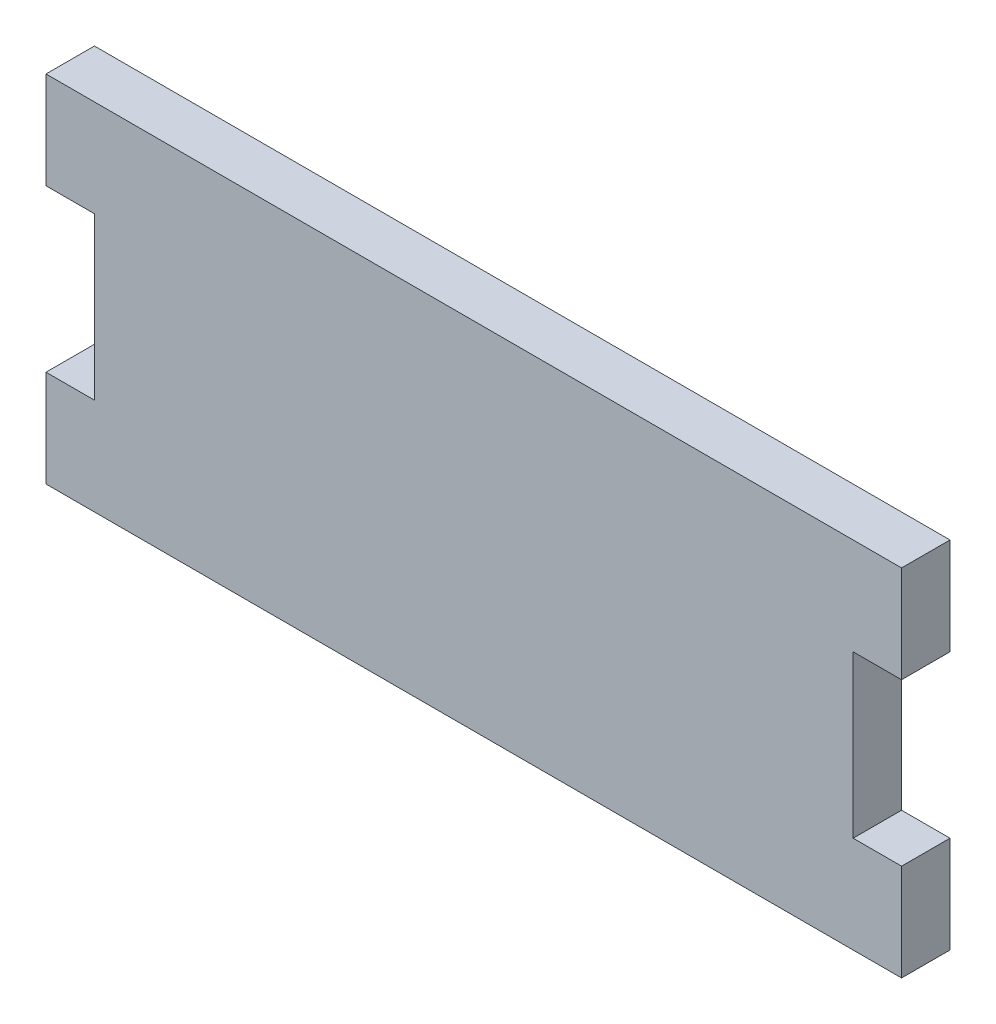
ISO-10303-21;
HEADER;
FILE_DESCRIPTION(('STEP AP214'),'2;1');
FILE_NAME('part.step','',(''),(''),'','','');
FILE_SCHEMA(('AUTOMOTIVE_DESIGN { 1 0 10303 214 1 1 1 1 }'));
ENDSEC;
DATA;
#1=APPLICATION_CONTEXT('core data for automotive mechanical design processes');
#2=APPLICATION_PROTOCOL_DEFINITION('international standard','automotive_design',2000,#1);
#3=PRODUCT_CONTEXT('',#1,'mechanical');
#4=PRODUCT('Part','Part','',(#3));
#5=PRODUCT_RELATED_PRODUCT_CATEGORY('part','',(#4));
#6=PRODUCT_DEFINITION_FORMATION('','',#4);
#7=PRODUCT_DEFINITION_CONTEXT('part definition',#1,'design');
#8=PRODUCT_DEFINITION('design','',#6,#7);
#9=PRODUCT_DEFINITION_SHAPE('','',#8);
#10=(LENGTH_UNIT() NAMED_UNIT(*) SI_UNIT(.MILLI.,.METRE.));
#11=(NAMED_UNIT(*) PLANE_ANGLE_UNIT() SI_UNIT($,.RADIAN.));
#12=(NAMED_UNIT(*) SI_UNIT($,.STERADIAN.) SOLID_ANGLE_UNIT());
#13=UNCERTAINTY_MEASURE_WITH_UNIT(LENGTH_MEASURE(1.E-05),#10,'distance_accuracy_value','');
#14=(GEOMETRIC_REPRESENTATION_CONTEXT(3) GLOBAL_UNCERTAINTY_ASSIGNED_CONTEXT((#13)) GLOBAL_UNIT_ASSIGNED_CONTEXT((#10,
#11,#12)) REPRESENTATION_CONTEXT('',''));
#15=CARTESIAN_POINT('',(0.,0.,0.));
#16=DIRECTION('',(0.,0.,1.));
#17=DIRECTION('',(1.,0.,0.));
#18=AXIS2_PLACEMENT_3D('',#15,#16,#17);
#19=CARTESIAN_POINT('',(54.,11.,1.5));
#20=DIRECTION('',(1.,0.,0.));
#21=DIRECTION('',(0.,0.,-1.));
#22=AXIS2_PLACEMENT_3D('',#19,#20,#21);
#23=PLANE('',#22);
#24=DIRECTION('',(0.,0.,1.));
#25=VECTOR('',#24,1.);
#26=CARTESIAN_POINT('',(54.,5.,-1.5));
#27=LINE('',#26,#25);
#28=CARTESIAN_POINT('',(54.,5.,-1.5));
#29=VERTEX_POINT('',#28);
#30=CARTESIAN_POINT('',(54.,5.,1.5));
#31=VERTEX_POINT('',#30);
#32=EDGE_CURVE('E204',#29,#31,#27,.T.);
#33=ORIENTED_EDGE('',*,*,#32,.F.);
#34=DIRECTION('',(0.,-1.,0.));
#35=VECTOR('',#34,1.);
#36=CARTESIAN_POINT('',(54.,11.,-1.5));
#37=LINE('',#36,#35);
#38=CARTESIAN_POINT('',(54.,11.,-1.5));
#39=VERTEX_POINT('',#38);
#40=EDGE_CURVE('E149',#39,#29,#37,.T.);
#41=ORIENTED_EDGE('',*,*,#40,.F.);
#42=DIRECTION('',(0.,0.,-1.));
#43=VECTOR('',#42,1.);
#44=CARTESIAN_POINT('',(54.,11.,1.5));
#45=LINE('',#44,#43);
#46=CARTESIAN_POINT('',(54.,11.,1.5));
#47=VERTEX_POINT('',#46);
#48=EDGE_CURVE('E40',#47,#39,#45,.T.);
#49=ORIENTED_EDGE('',*,*,#48,.F.);
#50=DIRECTION('',(0.,-1.,0.));
#51=VECTOR('',#50,1.);
#52=CARTESIAN_POINT('',(54.,11.,1.5));
#53=LINE('',#52,#51);
#54=EDGE_CURVE('E158',#47,#31,#53,.T.);
#55=ORIENTED_EDGE('',*,*,#54,.T.);
#56=EDGE_LOOP('',(#33,#41,#49,#55));
#57=FACE_BOUND('',#56,.T.);
#58=ADVANCED_FACE('F32',(#57),#23,.T.);
#59=CARTESIAN_POINT('',(35.,-11.,1.5));
#60=DIRECTION('',(0.,1.,0.));
#61=DIRECTION('',(-1.,0.,0.));
#62=AXIS2_PLACEMENT_3D('',#59,#60,#61);
#63=PLANE('',#62);
#64=DIRECTION('',(1.,0.,0.));
#65=VECTOR('',#64,1.);
#66=CARTESIAN_POINT('',(35.,-11.,-1.5));
#67=LINE('',#66,#65);
#68=CARTESIAN_POINT('',(1.00000000000002,-11.,-1.5));
#69=VERTEX_POINT('',#68);
#70=CARTESIAN_POINT('',(54.,-11.,-1.5));
#71=VERTEX_POINT('',#70);
#72=EDGE_CURVE('E162',#69,#71,#67,.T.);
#73=ORIENTED_EDGE('',*,*,#72,.T.);
#74=DIRECTION('',(0.,0.,-1.));
#75=VECTOR('',#74,1.);
#76=CARTESIAN_POINT('',(54.,-11.,1.5));
#77=LINE('',#76,#75);
#78=CARTESIAN_POINT('',(54.,-11.,1.5));
#79=VERTEX_POINT('',#78);
#80=EDGE_CURVE('E11',#79,#71,#77,.T.);
#81=ORIENTED_EDGE('',*,*,#80,.F.);
#82=DIRECTION('',(1.,0.,0.));
#83=VECTOR('',#82,1.);
#84=CARTESIAN_POINT('',(35.,-11.,1.5));
#85=LINE('',#84,#83);
#86=CARTESIAN_POINT('',(1.00000000000002,-11.,1.5));
#87=VERTEX_POINT('',#86);
#88=EDGE_CURVE('E148',#87,#79,#85,.T.);
#89=ORIENTED_EDGE('',*,*,#88,.F.);
#90=DIRECTION('',(0.,0.,-1.));
#91=VECTOR('',#90,1.);
#92=CARTESIAN_POINT('',(1.00000000000002,-11.,1.5));
#93=LINE('',#92,#91);
#94=EDGE_CURVE('E132',#87,#69,#93,.T.);
#95=ORIENTED_EDGE('',*,*,#94,.T.);
#96=EDGE_LOOP('',(#73,#81,#89,#95));
#97=FACE_BOUND('',#96,.T.);
#98=ADVANCED_FACE('F34',(#97),#63,.F.);
#99=DIRECTION('',(0.,0.,1.));
#100=VECTOR('',#99,1.);
#101=CARTESIAN_POINT('',(54.,-5.,-1.5));
#102=LINE('',#101,#100);
#103=CARTESIAN_POINT('',(54.,-5.,-1.5));
#104=VERTEX_POINT('',#103);
#105=CARTESIAN_POINT('',(54.,-5.,1.5));
#106=VERTEX_POINT('',#105);
#107=EDGE_CURVE('E47',#104,#106,#102,.T.);
#108=ORIENTED_EDGE('',*,*,#107,.T.);
#109=EDGE_CURVE('E152',#106,#79,#53,.T.);
#110=ORIENTED_EDGE('',*,*,#109,.T.);
#111=ORIENTED_EDGE('',*,*,#80,.T.);
#112=EDGE_CURVE('E154',#104,#71,#37,.T.);
#113=ORIENTED_EDGE('',*,*,#112,.F.);
#114=EDGE_LOOP('',(#108,#110,#111,#113));
#115=FACE_BOUND('',#114,.T.);
#116=ADVANCED_FACE('F243',(#115),#23,.T.);
#117=CARTESIAN_POINT('',(-54.,11.,1.5));
#118=DIRECTION('',(0.,1.,0.));
#119=DIRECTION('',(-1.,0.,0.));
#120=AXIS2_PLACEMENT_3D('',#117,#118,#119);
#121=PLANE('',#120);
#122=DIRECTION('',(0.,0.,1.));
#123=VECTOR('',#122,1.);
#124=CARTESIAN_POINT('',(1.00000000000002,11.,-1.5));
#125=LINE('',#124,#123);
#126=CARTESIAN_POINT('',(1.00000000000002,11.,-1.5));
#127=VERTEX_POINT('',#126);
#128=CARTESIAN_POINT('',(1.00000000000002,11.,1.5));
#129=VERTEX_POINT('',#128);
#130=EDGE_CURVE('E122',#127,#129,#125,.T.);
#131=ORIENTED_EDGE('',*,*,#130,.T.);
#132=DIRECTION('',(1.,0.,0.));
#133=VECTOR('',#132,1.);
#134=CARTESIAN_POINT('',(-54.,11.,1.5));
#135=LINE('',#134,#133);
#136=EDGE_CURVE('E157',#129,#47,#135,.T.);
#137=ORIENTED_EDGE('',*,*,#136,.T.);
#138=ORIENTED_EDGE('',*,*,#48,.T.);
#139=DIRECTION('',(1.,0.,0.));
#140=VECTOR('',#139,1.);
#141=CARTESIAN_POINT('',(-54.,11.,-1.5));
#142=LINE('',#141,#140);
#143=EDGE_CURVE('E139',#127,#39,#142,.T.);
#144=ORIENTED_EDGE('',*,*,#143,.F.);
#145=EDGE_LOOP('',(#131,#137,#138,#144));
#146=FACE_BOUND('',#145,.T.);
#147=ADVANCED_FACE('F145',(#146),#121,.T.);
#148=CARTESIAN_POINT('',(0.,0.,1.5));
#149=DIRECTION('',(0.,0.,1.));
#150=DIRECTION('',(1.,0.,0.));
#151=AXIS2_PLACEMENT_3D('',#148,#149,#150);
#152=PLANE('',#151);
#153=DIRECTION('',(0.,1.,0.));
#154=VECTOR('',#153,1.);
#155=CARTESIAN_POINT('',(1.00000000000002,11.,1.5));
#156=LINE('',#155,#154);
#157=CARTESIAN_POINT('',(1.00000000000003,-5.00000000000001,1.5));
#158=VERTEX_POINT('',#157);
#159=EDGE_CURVE('E55',#87,#158,#156,.T.);
#160=ORIENTED_EDGE('',*,*,#159,.F.);
#161=ORIENTED_EDGE('',*,*,#88,.T.);
#162=ORIENTED_EDGE('',*,*,#109,.F.);
#163=DIRECTION('',(1.,0.,0.));
#164=VECTOR('',#163,1.);
#165=CARTESIAN_POINT('',(51.,-5.00000000000001,1.5));
#166=LINE('',#165,#164);
#167=CARTESIAN_POINT('',(51.,-5.00000000000001,1.5));
#168=VERTEX_POINT('',#167);
#169=EDGE_CURVE('E211',#168,#106,#166,.T.);
#170=ORIENTED_EDGE('',*,*,#169,.F.);
#171=DIRECTION('',(0.,-1.,0.));
#172=VECTOR('',#171,1.);
#173=CARTESIAN_POINT('',(51.,4.99999999999999,1.5));
#174=LINE('',#173,#172);
#175=CARTESIAN_POINT('',(51.,4.99999999999999,1.5));
#176=VERTEX_POINT('',#175);
#177=EDGE_CURVE('E213',#176,#168,#174,.T.);
#178=ORIENTED_EDGE('',*,*,#177,.F.);
#179=DIRECTION('',(-1.,0.,0.));
#180=VECTOR('',#179,1.);
#181=CARTESIAN_POINT('',(51.,4.99999999999999,1.5));
#182=LINE('',#181,#180);
#183=EDGE_CURVE('E207',#31,#176,#182,.T.);
#184=ORIENTED_EDGE('',*,*,#183,.F.);
#185=ORIENTED_EDGE('',*,*,#54,.F.);
#186=ORIENTED_EDGE('',*,*,#136,.F.);
#187=CARTESIAN_POINT('',(1.00000000000002,5.,1.5));
#188=VERTEX_POINT('',#187);
#189=EDGE_CURVE('E128',#188,#129,#156,.T.);
#190=ORIENTED_EDGE('',*,*,#189,.F.);
#191=DIRECTION('',(-1.,0.,0.));
#192=VECTOR('',#191,1.);
#193=CARTESIAN_POINT('',(1.00000000000002,4.99999999999999,1.5));
#194=LINE('',#193,#192);
#195=CARTESIAN_POINT('',(4.00000000000002,4.99999999999999,1.5));
#196=VERTEX_POINT('',#195);
#197=EDGE_CURVE('E173',#196,#188,#194,.T.);
#198=ORIENTED_EDGE('',*,*,#197,.F.);
#199=DIRECTION('',(0.,1.,0.));
#200=VECTOR('',#199,1.);
#201=CARTESIAN_POINT('',(4.00000000000002,4.99999999999999,1.5));
#202=LINE('',#201,#200);
#203=CARTESIAN_POINT('',(4.00000000000002,-5.00000000000001,1.5));
#204=VERTEX_POINT('',#203);
#205=EDGE_CURVE('E189',#204,#196,#202,.T.);
#206=ORIENTED_EDGE('',*,*,#205,.F.);
#207=DIRECTION('',(1.,0.,0.));
#208=VECTOR('',#207,1.);
#209=CARTESIAN_POINT('',(1.00000000000003,-5.00000000000001,1.5));
#210=LINE('',#209,#208);
#211=EDGE_CURVE('E188',#158,#204,#210,.T.);
#212=ORIENTED_EDGE('',*,*,#211,.F.);
#213=EDGE_LOOP('',(#160,#161,#162,#170,#178,#184,#185,#186,#190,#198,#206,#212));
#214=FACE_BOUND('',#213,.T.);
#215=ADVANCED_FACE('F226',(#214),#152,.T.);
#216=CARTESIAN_POINT('',(0.,0.,-1.5));
#217=DIRECTION('',(0.,0.,1.));
#218=DIRECTION('',(1.,0.,0.));
#219=AXIS2_PLACEMENT_3D('',#216,#217,#218);
#220=PLANE('',#219);
#221=ORIENTED_EDGE('',*,*,#72,.F.);
#222=DIRECTION('',(0.,1.,0.));
#223=VECTOR('',#222,1.);
#224=CARTESIAN_POINT('',(1.00000000000002,11.,-1.5));
#225=LINE('',#224,#223);
#226=CARTESIAN_POINT('',(1.00000000000002,-5.,-1.5));
#227=VERTEX_POINT('',#226);
#228=EDGE_CURVE('E133',#69,#227,#225,.T.);
#229=ORIENTED_EDGE('',*,*,#228,.T.);
#230=DIRECTION('',(1.,0.,0.));
#231=VECTOR('',#230,1.);
#232=CARTESIAN_POINT('',(1.00000000000003,-5.00000000000001,-1.5));
#233=LINE('',#232,#231);
#234=CARTESIAN_POINT('',(4.00000000000002,-5.00000000000001,-1.5));
#235=VERTEX_POINT('',#234);
#236=EDGE_CURVE('E184',#227,#235,#233,.T.);
#237=ORIENTED_EDGE('',*,*,#236,.T.);
#238=DIRECTION('',(0.,1.,0.));
#239=VECTOR('',#238,1.);
#240=CARTESIAN_POINT('',(4.00000000000002,4.99999999999999,-1.5));
#241=LINE('',#240,#239);
#242=CARTESIAN_POINT('',(4.00000000000002,4.99999999999999,-1.5));
#243=VERTEX_POINT('',#242);
#244=EDGE_CURVE('E182',#235,#243,#241,.T.);
#245=ORIENTED_EDGE('',*,*,#244,.T.);
#246=DIRECTION('',(-1.,0.,0.));
#247=VECTOR('',#246,1.);
#248=CARTESIAN_POINT('',(1.00000000000002,4.99999999999999,-1.5));
#249=LINE('',#248,#247);
#250=CARTESIAN_POINT('',(1.00000000000002,4.99999999999999,-1.5));
#251=VERTEX_POINT('',#250);
#252=EDGE_CURVE('E143',#243,#251,#249,.T.);
#253=ORIENTED_EDGE('',*,*,#252,.T.);
#254=EDGE_CURVE('E125',#251,#127,#225,.T.);
#255=ORIENTED_EDGE('',*,*,#254,.T.);
#256=ORIENTED_EDGE('',*,*,#143,.T.);
#257=ORIENTED_EDGE('',*,*,#40,.T.);
#258=DIRECTION('',(-1.,0.,0.));
#259=VECTOR('',#258,1.);
#260=CARTESIAN_POINT('',(51.,4.99999999999999,-1.5));
#261=LINE('',#260,#259);
#262=CARTESIAN_POINT('',(51.,4.99999999999999,-1.5));
#263=VERTEX_POINT('',#262);
#264=EDGE_CURVE('E202',#29,#263,#261,.T.);
#265=ORIENTED_EDGE('',*,*,#264,.T.);
#266=DIRECTION('',(0.,-1.,0.));
#267=VECTOR('',#266,1.);
#268=CARTESIAN_POINT('',(51.,4.99999999999999,-1.5));
#269=LINE('',#268,#267);
#270=CARTESIAN_POINT('',(51.,-5.00000000000001,-1.5));
#271=VERTEX_POINT('',#270);
#272=EDGE_CURVE('E210',#263,#271,#269,.T.);
#273=ORIENTED_EDGE('',*,*,#272,.T.);
#274=DIRECTION('',(1.,0.,0.));
#275=VECTOR('',#274,1.);
#276=CARTESIAN_POINT('',(51.,-5.00000000000001,-1.5));
#277=LINE('',#276,#275);
#278=EDGE_CURVE('E218',#271,#104,#277,.T.);
#279=ORIENTED_EDGE('',*,*,#278,.T.);
#280=ORIENTED_EDGE('',*,*,#112,.T.);
#281=EDGE_LOOP('',(#221,#229,#237,#245,#253,#255,#256,#257,#265,#273,#279,#280));
#282=FACE_BOUND('',#281,.T.);
#283=ADVANCED_FACE('F137',(#282),#220,.F.);
#284=CARTESIAN_POINT('',(1.00000000000002,4.99999999999999,-1.5));
#285=DIRECTION('',(0.,1.,0.));
#286=DIRECTION('',(0.,0.,1.));
#287=AXIS2_PLACEMENT_3D('',#284,#285,#286);
#288=PLANE('',#287);
#289=ORIENTED_EDGE('',*,*,#197,.T.);
#290=DIRECTION('',(0.,0.,1.));
#291=VECTOR('',#290,1.);
#292=CARTESIAN_POINT('',(1.00000000000002,4.99999999999999,-1.5));
#293=LINE('',#292,#291);
#294=EDGE_CURVE('E164',#251,#188,#293,.T.);
#295=ORIENTED_EDGE('',*,*,#294,.F.);
#296=ORIENTED_EDGE('',*,*,#252,.F.);
#297=DIRECTION('',(0.,0.,1.));
#298=VECTOR('',#297,1.);
#299=CARTESIAN_POINT('',(4.00000000000002,4.99999999999999,-1.5));
#300=LINE('',#299,#298);
#301=EDGE_CURVE('E168',#243,#196,#300,.T.);
#302=ORIENTED_EDGE('',*,*,#301,.T.);
#303=EDGE_LOOP('',(#289,#295,#296,#302));
#304=FACE_BOUND('',#303,.T.);
#305=ADVANCED_FACE('F231',(#304),#288,.F.);
#306=CARTESIAN_POINT('',(4.00000000000002,4.99999999999999,-1.5));
#307=DIRECTION('',(1.,0.,0.));
#308=DIRECTION('',(0.,0.,-1.));
#309=AXIS2_PLACEMENT_3D('',#306,#307,#308);
#310=PLANE('',#309);
#311=ORIENTED_EDGE('',*,*,#205,.T.);
#312=ORIENTED_EDGE('',*,*,#301,.F.);
#313=ORIENTED_EDGE('',*,*,#244,.F.);
#314=DIRECTION('',(0.,0.,1.));
#315=VECTOR('',#314,1.);
#316=CARTESIAN_POINT('',(4.00000000000002,-5.00000000000001,-1.5));
#317=LINE('',#316,#315);
#318=EDGE_CURVE('E170',#235,#204,#317,.T.);
#319=ORIENTED_EDGE('',*,*,#318,.T.);
#320=EDGE_LOOP('',(#311,#312,#313,#319));
#321=FACE_BOUND('',#320,.T.);
#322=ADVANCED_FACE('F230',(#321),#310,.F.);
#323=CARTESIAN_POINT('',(1.00000000000003,-5.00000000000001,-1.5));
#324=DIRECTION('',(0.,-1.,0.));
#325=DIRECTION('',(0.,0.,-1.));
#326=AXIS2_PLACEMENT_3D('',#323,#324,#325);
#327=PLANE('',#326);
#328=ORIENTED_EDGE('',*,*,#211,.T.);
#329=ORIENTED_EDGE('',*,*,#318,.F.);
#330=ORIENTED_EDGE('',*,*,#236,.F.);
#331=DIRECTION('',(0.,0.,1.));
#332=VECTOR('',#331,1.);
#333=CARTESIAN_POINT('',(1.00000000000003,-5.00000000000001,-1.5));
#334=LINE('',#333,#332);
#335=EDGE_CURVE('E177',#227,#158,#334,.T.);
#336=ORIENTED_EDGE('',*,*,#335,.T.);
#337=EDGE_LOOP('',(#328,#329,#330,#336));
#338=FACE_BOUND('',#337,.T.);
#339=ADVANCED_FACE('F229',(#338),#327,.F.);
#340=CARTESIAN_POINT('',(51.,4.99999999999999,-1.5));
#341=DIRECTION('',(-1.,0.,0.));
#342=DIRECTION('',(0.,0.,1.));
#343=AXIS2_PLACEMENT_3D('',#340,#341,#342);
#344=PLANE('',#343);
#345=ORIENTED_EDGE('',*,*,#177,.T.);
#346=DIRECTION('',(0.,0.,1.));
#347=VECTOR('',#346,1.);
#348=CARTESIAN_POINT('',(51.,-5.00000000000001,-1.5));
#349=LINE('',#348,#347);
#350=EDGE_CURVE('E200',#271,#168,#349,.T.);
#351=ORIENTED_EDGE('',*,*,#350,.F.);
#352=ORIENTED_EDGE('',*,*,#272,.F.);
#353=DIRECTION('',(0.,0.,1.));
#354=VECTOR('',#353,1.);
#355=CARTESIAN_POINT('',(51.,4.99999999999999,-1.5));
#356=LINE('',#355,#354);
#357=EDGE_CURVE('E190',#263,#176,#356,.T.);
#358=ORIENTED_EDGE('',*,*,#357,.T.);
#359=EDGE_LOOP('',(#345,#351,#352,#358));
#360=FACE_BOUND('',#359,.T.);
#361=ADVANCED_FACE('F261',(#360),#344,.F.);
#362=CARTESIAN_POINT('',(51.,4.99999999999999,-1.5));
#363=DIRECTION('',(0.,1.,0.));
#364=DIRECTION('',(-1.,0.,0.));
#365=AXIS2_PLACEMENT_3D('',#362,#363,#364);
#366=PLANE('',#365);
#367=ORIENTED_EDGE('',*,*,#183,.T.);
#368=ORIENTED_EDGE('',*,*,#357,.F.);
#369=ORIENTED_EDGE('',*,*,#264,.F.);
#370=ORIENTED_EDGE('',*,*,#32,.T.);
#371=EDGE_LOOP('',(#367,#368,#369,#370));
#372=FACE_BOUND('',#371,.T.);
#373=ADVANCED_FACE('F263',(#372),#366,.F.);
#374=CARTESIAN_POINT('',(51.,-5.00000000000001,-1.5));
#375=DIRECTION('',(0.,-1.,0.));
#376=DIRECTION('',(1.,0.,0.));
#377=AXIS2_PLACEMENT_3D('',#374,#375,#376);
#378=PLANE('',#377);
#379=ORIENTED_EDGE('',*,*,#169,.T.);
#380=ORIENTED_EDGE('',*,*,#107,.F.);
#381=ORIENTED_EDGE('',*,*,#278,.F.);
#382=ORIENTED_EDGE('',*,*,#350,.T.);
#383=EDGE_LOOP('',(#379,#380,#381,#382));
#384=FACE_BOUND('',#383,.T.);
#385=ADVANCED_FACE('F258',(#384),#378,.F.);
#386=CARTESIAN_POINT('',(1.00000000000002,11.,-1.5));
#387=DIRECTION('',(1.,0.,0.));
#388=DIRECTION('',(0.,0.,-1.));
#389=AXIS2_PLACEMENT_3D('',#386,#387,#388);
#390=PLANE('',#389);
#391=ORIENTED_EDGE('',*,*,#159,.T.);
#392=ORIENTED_EDGE('',*,*,#335,.F.);
#393=ORIENTED_EDGE('',*,*,#228,.F.);
#394=ORIENTED_EDGE('',*,*,#94,.F.);
#395=EDGE_LOOP('',(#391,#392,#393,#394));
#396=FACE_BOUND('',#395,.T.);
#397=ADVANCED_FACE('F224',(#396),#390,.F.);
#398=ORIENTED_EDGE('',*,*,#189,.T.);
#399=ORIENTED_EDGE('',*,*,#130,.F.);
#400=ORIENTED_EDGE('',*,*,#254,.F.);
#401=ORIENTED_EDGE('',*,*,#294,.T.);
#402=EDGE_LOOP('',(#398,#399,#400,#401));
#403=FACE_BOUND('',#402,.T.);
#404=ADVANCED_FACE('F124',(#403),#390,.F.);
#405=CLOSED_SHELL('',(#58,#98,#116,#147,#215,#283,#305,#322,#339,#361,#373,#385,#397,#404));
#406=MANIFOLD_SOLID_BREP('B2',#405);
#407=ADVANCED_BREP_SHAPE_REPRESENTATION('',(#18,#406),#14);
#408=SHAPE_DEFINITION_REPRESENTATION(#9,#407);
ENDSEC;
END-ISO-10303-21;
